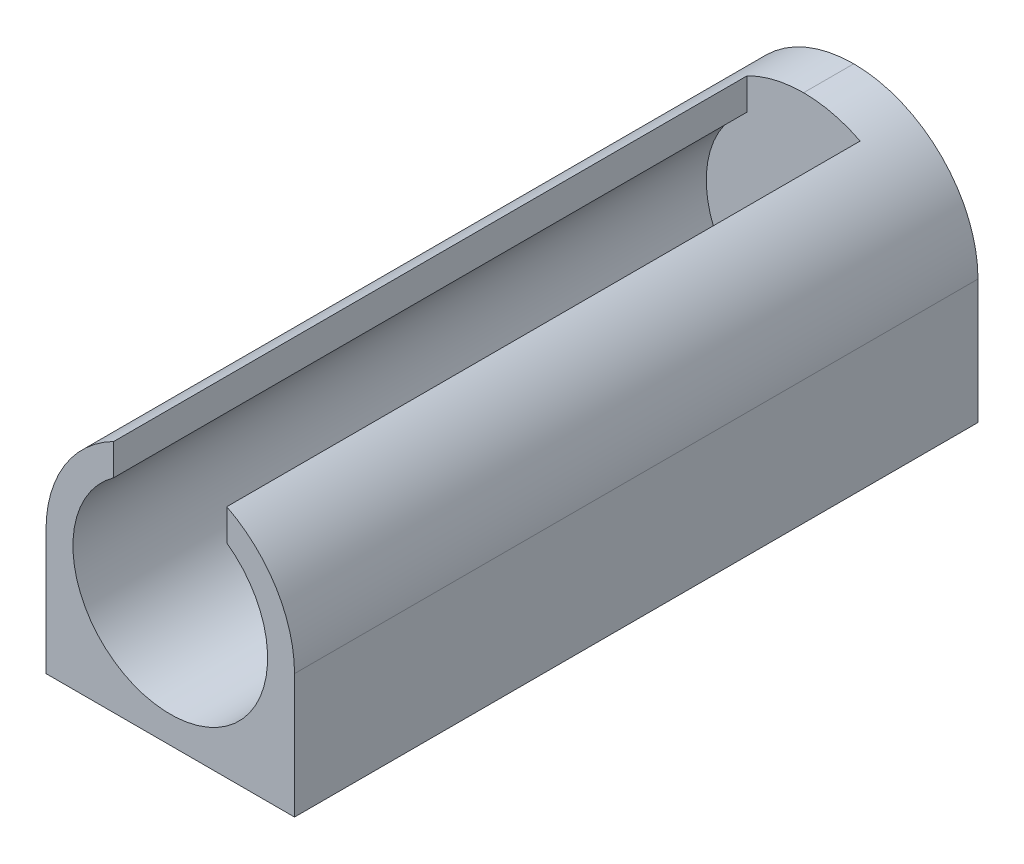
ISO-10303-21;
HEADER;
FILE_DESCRIPTION(('STEP AP214'),'2;1');
FILE_NAME('part.step','',(''),(''),'','','');
FILE_SCHEMA(('AUTOMOTIVE_DESIGN { 1 0 10303 214 1 1 1 1 }'));
ENDSEC;
DATA;
#1=APPLICATION_CONTEXT('core data for automotive mechanical design processes');
#2=APPLICATION_PROTOCOL_DEFINITION('international standard','automotive_design',2000,#1);
#3=PRODUCT_CONTEXT('',#1,'mechanical');
#4=PRODUCT('Part','Part','',(#3));
#5=PRODUCT_RELATED_PRODUCT_CATEGORY('part','',(#4));
#6=PRODUCT_DEFINITION_FORMATION('','',#4);
#7=PRODUCT_DEFINITION_CONTEXT('part definition',#1,'design');
#8=PRODUCT_DEFINITION('design','',#6,#7);
#9=PRODUCT_DEFINITION_SHAPE('','',#8);
#10=(LENGTH_UNIT() NAMED_UNIT(*) SI_UNIT(.MILLI.,.METRE.));
#11=(NAMED_UNIT(*) PLANE_ANGLE_UNIT() SI_UNIT($,.RADIAN.));
#12=(NAMED_UNIT(*) SI_UNIT($,.STERADIAN.) SOLID_ANGLE_UNIT());
#13=UNCERTAINTY_MEASURE_WITH_UNIT(LENGTH_MEASURE(1.E-05),#10,'distance_accuracy_value','');
#14=(GEOMETRIC_REPRESENTATION_CONTEXT(3) GLOBAL_UNCERTAINTY_ASSIGNED_CONTEXT((#13)) GLOBAL_UNIT_ASSIGNED_CONTEXT((#10,
#11,#12)) REPRESENTATION_CONTEXT('',''));
#15=CARTESIAN_POINT('',(0.,0.,0.));
#16=DIRECTION('',(0.,0.,1.));
#17=DIRECTION('',(1.,0.,0.));
#18=AXIS2_PLACEMENT_3D('',#15,#16,#17);
#19=CARTESIAN_POINT('',(0.,0.,41.91));
#20=DIRECTION('',(1.,0.,0.));
#21=DIRECTION('',(0.,0.,-1.));
#22=AXIS2_PLACEMENT_3D('',#19,#20,#21);
#23=PLANE('',#22);
#24=DIRECTION('',(0.,-1.,0.));
#25=VECTOR('',#24,1.);
#26=CARTESIAN_POINT('',(0.,0.,41.91));
#27=LINE('',#26,#25);
#28=CARTESIAN_POINT('',(0.,7.62,41.91));
#29=VERTEX_POINT('',#28);
#30=CARTESIAN_POINT('',(0.,0.,41.91));
#31=VERTEX_POINT('',#30);
#32=EDGE_CURVE('E136',#29,#31,#27,.T.);
#33=ORIENTED_EDGE('',*,*,#32,.F.);
#34=DIRECTION('',(0.,0.,-1.));
#35=VECTOR('',#34,1.);
#36=CARTESIAN_POINT('',(0.,7.62,41.91));
#37=LINE('',#36,#35);
#38=CARTESIAN_POINT('',(0.,7.62,0.));
#39=VERTEX_POINT('',#38);
#40=EDGE_CURVE('E165',#29,#39,#37,.T.);
#41=ORIENTED_EDGE('',*,*,#40,.T.);
#42=DIRECTION('',(0.,-1.,0.));
#43=VECTOR('',#42,1.);
#44=CARTESIAN_POINT('',(0.,0.,0.));
#45=LINE('',#44,#43);
#46=CARTESIAN_POINT('',(0.,0.,0.));
#47=VERTEX_POINT('',#46);
#48=EDGE_CURVE('E129',#39,#47,#45,.T.);
#49=ORIENTED_EDGE('',*,*,#48,.T.);
#50=DIRECTION('',(0.,0.,-1.));
#51=VECTOR('',#50,1.);
#52=CARTESIAN_POINT('',(0.,0.,41.91));
#53=LINE('',#52,#51);
#54=EDGE_CURVE('E152',#31,#47,#53,.T.);
#55=ORIENTED_EDGE('',*,*,#54,.F.);
#56=EDGE_LOOP('',(#33,#41,#49,#55));
#57=FACE_BOUND('',#56,.T.);
#58=ADVANCED_FACE('F35',(#57),#23,.F.);
#59=CARTESIAN_POINT('',(0.,0.,41.91));
#60=DIRECTION('',(0.,1.,0.));
#61=DIRECTION('',(0.,0.,1.));
#62=AXIS2_PLACEMENT_3D('',#59,#60,#61);
#63=PLANE('',#62);
#64=DIRECTION('',(1.,0.,0.));
#65=VECTOR('',#64,1.);
#66=CARTESIAN_POINT('',(0.,0.,0.));
#67=LINE('',#66,#65);
#68=CARTESIAN_POINT('',(15.24,0.,0.));
#69=VERTEX_POINT('',#68);
#70=EDGE_CURVE('E146',#47,#69,#67,.T.);
#71=ORIENTED_EDGE('',*,*,#70,.T.);
#72=DIRECTION('',(0.,0.,-1.));
#73=VECTOR('',#72,1.);
#74=CARTESIAN_POINT('',(15.24,0.,41.91));
#75=LINE('',#74,#73);
#76=CARTESIAN_POINT('',(15.24,0.,41.91));
#77=VERTEX_POINT('',#76);
#78=EDGE_CURVE('E144',#77,#69,#75,.T.);
#79=ORIENTED_EDGE('',*,*,#78,.F.);
#80=DIRECTION('',(1.,0.,0.));
#81=VECTOR('',#80,1.);
#82=CARTESIAN_POINT('',(0.,0.,41.91));
#83=LINE('',#82,#81);
#84=EDGE_CURVE('E138',#31,#77,#83,.T.);
#85=ORIENTED_EDGE('',*,*,#84,.F.);
#86=ORIENTED_EDGE('',*,*,#54,.T.);
#87=EDGE_LOOP('',(#71,#79,#85,#86));
#88=FACE_BOUND('',#87,.T.);
#89=ADVANCED_FACE('F210',(#88),#63,.F.);
#90=CARTESIAN_POINT('',(15.24,0.,41.91));
#91=DIRECTION('',(-1.,0.,0.));
#92=DIRECTION('',(0.,0.,1.));
#93=AXIS2_PLACEMENT_3D('',#90,#91,#92);
#94=PLANE('',#93);
#95=DIRECTION('',(0.,1.,0.));
#96=VECTOR('',#95,1.);
#97=CARTESIAN_POINT('',(15.24,0.,0.));
#98=LINE('',#97,#96);
#99=CARTESIAN_POINT('',(15.24,7.62,0.));
#100=VERTEX_POINT('',#99);
#101=EDGE_CURVE('E139',#69,#100,#98,.T.);
#102=ORIENTED_EDGE('',*,*,#101,.T.);
#103=DIRECTION('',(0.,0.,-1.));
#104=VECTOR('',#103,1.);
#105=CARTESIAN_POINT('',(15.24,7.62,41.91));
#106=LINE('',#105,#104);
#107=CARTESIAN_POINT('',(15.24,7.62,41.91));
#108=VERTEX_POINT('',#107);
#109=EDGE_CURVE('E159',#100,#108,#106,.F.);
#110=ORIENTED_EDGE('',*,*,#109,.T.);
#111=DIRECTION('',(0.,1.,0.));
#112=VECTOR('',#111,1.);
#113=CARTESIAN_POINT('',(15.24,0.,41.91));
#114=LINE('',#113,#112);
#115=EDGE_CURVE('E141',#77,#108,#114,.T.);
#116=ORIENTED_EDGE('',*,*,#115,.F.);
#117=ORIENTED_EDGE('',*,*,#78,.T.);
#118=EDGE_LOOP('',(#102,#110,#116,#117));
#119=FACE_BOUND('',#118,.T.);
#120=ADVANCED_FACE('F216',(#119),#94,.F.);
#121=CARTESIAN_POINT('',(0.,0.,41.91));
#122=DIRECTION('',(0.,0.,-1.));
#123=DIRECTION('',(-1.,0.,0.));
#124=AXIS2_PLACEMENT_3D('',#121,#122,#123);
#125=PLANE('',#124);
#126=CARTESIAN_POINT('',(7.62,7.62,41.91));
#127=DIRECTION('',(0.,0.,1.));
#128=DIRECTION('',(1.,0.,0.));
#129=AXIS2_PLACEMENT_3D('',#126,#127,#128);
#130=CIRCLE('',#129,5.969);
#131=CARTESIAN_POINT('',(4.15421620917245,12.4797637509695,41.91));
#132=VERTEX_POINT('',#131);
#133=CARTESIAN_POINT('',(11.0857837908275,12.4797637509695,41.91));
#134=VERTEX_POINT('',#133);
#135=EDGE_CURVE('E120',#132,#134,#130,.T.);
#136=ORIENTED_EDGE('',*,*,#135,.F.);
#137=DIRECTION('',(0.,-1.,0.));
#138=VECTOR('',#137,1.);
#139=CARTESIAN_POINT('',(4.15421620917245,12.4797637509695,41.91));
#140=LINE('',#139,#138);
#141=CARTESIAN_POINT('',(4.15421620917245,14.4062171137709,41.91));
#142=VERTEX_POINT('',#141);
#143=EDGE_CURVE('E105',#142,#132,#140,.T.);
#144=ORIENTED_EDGE('',*,*,#143,.F.);
#145=CARTESIAN_POINT('',(7.62,7.62,41.91));
#146=DIRECTION('',(0.,0.,-1.));
#147=DIRECTION('',(-1.,0.,0.));
#148=AXIS2_PLACEMENT_3D('',#145,#146,#147);
#149=CIRCLE('',#148,7.62);
#150=EDGE_CURVE('E58',#142,#29,#149,.F.);
#151=ORIENTED_EDGE('',*,*,#150,.T.);
#152=ORIENTED_EDGE('',*,*,#32,.T.);
#153=ORIENTED_EDGE('',*,*,#84,.T.);
#154=ORIENTED_EDGE('',*,*,#115,.T.);
#155=CARTESIAN_POINT('',(7.62,7.62,41.91));
#156=DIRECTION('',(0.,0.,-1.));
#157=DIRECTION('',(-1.,0.,0.));
#158=AXIS2_PLACEMENT_3D('',#155,#156,#157);
#159=CIRCLE('',#158,7.62);
#160=CARTESIAN_POINT('',(11.0857837908275,14.4062171137709,41.91));
#161=VERTEX_POINT('',#160);
#162=EDGE_CURVE('E163',#108,#161,#159,.F.);
#163=ORIENTED_EDGE('',*,*,#162,.T.);
#164=DIRECTION('',(0.,1.,0.));
#165=VECTOR('',#164,1.);
#166=CARTESIAN_POINT('',(11.0857837908275,12.4797637509695,41.91));
#167=LINE('',#166,#165);
#168=EDGE_CURVE('E113',#134,#161,#167,.T.);
#169=ORIENTED_EDGE('',*,*,#168,.F.);
#170=EDGE_LOOP('',(#136,#144,#151,#152,#153,#154,#163,#169));
#171=FACE_BOUND('',#170,.T.);
#172=ADVANCED_FACE('F125',(#171),#125,.F.);
#173=CARTESIAN_POINT('',(0.,0.,0.));
#174=DIRECTION('',(0.,0.,-1.));
#175=DIRECTION('',(-1.,0.,0.));
#176=AXIS2_PLACEMENT_3D('',#173,#174,#175);
#177=PLANE('',#176);
#178=CARTESIAN_POINT('',(7.62,7.61999999999998,0.));
#179=DIRECTION('',(0.,0.,1.));
#180=DIRECTION('',(1.,0.,0.));
#181=AXIS2_PLACEMENT_3D('',#178,#179,#180);
#182=CIRCLE('',#181,1.4605);
#183=CARTESIAN_POINT('',(9.0805,7.61999999999998,0.));
#184=VERTEX_POINT('',#183);
#185=EDGE_CURVE('E114',#184,#184,#182,.T.);
#186=ORIENTED_EDGE('',*,*,#185,.T.);
#187=EDGE_LOOP('',(#186));
#188=FACE_BOUND('',#187,.T.);
#189=CARTESIAN_POINT('',(7.62,7.62,0.));
#190=DIRECTION('',(0.,0.,-1.));
#191=DIRECTION('',(-1.,0.,0.));
#192=AXIS2_PLACEMENT_3D('',#189,#190,#191);
#193=CIRCLE('',#192,7.62);
#194=CARTESIAN_POINT('',(7.62,15.24,0.));
#195=VERTEX_POINT('',#194);
#196=EDGE_CURVE('E155',#39,#195,#193,.T.);
#197=ORIENTED_EDGE('',*,*,#196,.T.);
#198=CARTESIAN_POINT('',(7.62,7.62,0.));
#199=DIRECTION('',(0.,0.,-1.));
#200=DIRECTION('',(-1.,0.,0.));
#201=AXIS2_PLACEMENT_3D('',#198,#199,#200);
#202=CIRCLE('',#201,7.62);
#203=EDGE_CURVE('E157',#195,#100,#202,.T.);
#204=ORIENTED_EDGE('',*,*,#203,.T.);
#205=ORIENTED_EDGE('',*,*,#101,.F.);
#206=ORIENTED_EDGE('',*,*,#70,.F.);
#207=ORIENTED_EDGE('',*,*,#48,.F.);
#208=EDGE_LOOP('',(#197,#204,#205,#206,#207));
#209=FACE_BOUND('',#208,.T.);
#210=ADVANCED_FACE('F192',(#188,#209),#177,.T.);
#211=CARTESIAN_POINT('',(7.62,7.62,3.0734));
#212=DIRECTION('',(0.,0.,1.));
#213=DIRECTION('',(1.,0.,0.));
#214=AXIS2_PLACEMENT_3D('',#211,#212,#213);
#215=CYLINDRICAL_SURFACE('',#214,5.969);
#216=CARTESIAN_POINT('',(7.62,7.62,3.0734));
#217=DIRECTION('',(0.,0.,1.));
#218=DIRECTION('',(1.,0.,0.));
#219=AXIS2_PLACEMENT_3D('',#216,#217,#218);
#220=CIRCLE('',#219,5.969);
#221=CARTESIAN_POINT('',(4.15421620917245,12.4797637509695,3.0734));
#222=VERTEX_POINT('',#221);
#223=CARTESIAN_POINT('',(11.0857837908275,12.4797637509695,3.0734));
#224=VERTEX_POINT('',#223);
#225=EDGE_CURVE('E121',#222,#224,#220,.T.);
#226=ORIENTED_EDGE('',*,*,#225,.F.);
#227=DIRECTION('',(0.,0.,1.));
#228=VECTOR('',#227,1.);
#229=CARTESIAN_POINT('',(4.15421620917245,12.4797637509695,-4.528255374071));
#230=LINE('',#229,#228);
#231=EDGE_CURVE('E109',#222,#132,#230,.T.);
#232=ORIENTED_EDGE('',*,*,#231,.T.);
#233=ORIENTED_EDGE('',*,*,#135,.T.);
#234=DIRECTION('',(0.,0.,1.));
#235=VECTOR('',#234,1.);
#236=CARTESIAN_POINT('',(11.0857837908275,12.4797637509695,-4.528255374071));
#237=LINE('',#236,#235);
#238=EDGE_CURVE('E122',#224,#134,#237,.T.);
#239=ORIENTED_EDGE('',*,*,#238,.F.);
#240=EDGE_LOOP('',(#226,#232,#233,#239));
#241=FACE_BOUND('',#240,.T.);
#242=ADVANCED_FACE('F118',(#241),#215,.F.);
#243=CARTESIAN_POINT('',(7.62,7.62,3.0734));
#244=DIRECTION('',(0.,0.,1.));
#245=DIRECTION('',(1.,0.,0.));
#246=AXIS2_PLACEMENT_3D('',#243,#244,#245);
#247=PLANE('',#246);
#248=CARTESIAN_POINT('',(7.62,7.61999999999998,3.0734));
#249=DIRECTION('',(0.,0.,1.));
#250=DIRECTION('',(1.,0.,0.));
#251=AXIS2_PLACEMENT_3D('',#248,#249,#250);
#252=CIRCLE('',#251,1.4605);
#253=CARTESIAN_POINT('',(9.0805,7.61999999999998,3.0734));
#254=VERTEX_POINT('',#253);
#255=EDGE_CURVE('E186',#254,#254,#252,.T.);
#256=ORIENTED_EDGE('',*,*,#255,.F.);
#257=EDGE_LOOP('',(#256));
#258=FACE_BOUND('',#257,.T.);
#259=ORIENTED_EDGE('',*,*,#225,.T.);
#260=DIRECTION('',(0.,-1.,0.));
#261=VECTOR('',#260,1.);
#262=CARTESIAN_POINT('',(11.0857837908275,12.4797637509695,3.0734));
#263=LINE('',#262,#261);
#264=CARTESIAN_POINT('',(11.0857837908275,14.4062171137709,3.0734));
#265=VERTEX_POINT('',#264);
#266=EDGE_CURVE('E50',#265,#224,#263,.T.);
#267=ORIENTED_EDGE('',*,*,#266,.F.);
#268=CARTESIAN_POINT('',(7.62,7.62,3.0734));
#269=DIRECTION('',(0.,0.,1.));
#270=DIRECTION('',(1.,0.,0.));
#271=AXIS2_PLACEMENT_3D('',#268,#269,#270);
#272=CIRCLE('',#271,7.62);
#273=CARTESIAN_POINT('',(7.62,15.24,3.0734));
#274=VERTEX_POINT('',#273);
#275=EDGE_CURVE('E166',#274,#265,#272,.F.);
#276=ORIENTED_EDGE('',*,*,#275,.F.);
#277=CARTESIAN_POINT('',(7.62,7.62,3.0734));
#278=DIRECTION('',(0.,0.,1.));
#279=DIRECTION('',(1.,0.,0.));
#280=AXIS2_PLACEMENT_3D('',#277,#278,#279);
#281=CIRCLE('',#280,7.62);
#282=CARTESIAN_POINT('',(4.15421620917245,14.4062171137709,3.0734));
#283=VERTEX_POINT('',#282);
#284=EDGE_CURVE('E132',#283,#274,#281,.F.);
#285=ORIENTED_EDGE('',*,*,#284,.F.);
#286=DIRECTION('',(0.,1.,0.));
#287=VECTOR('',#286,1.);
#288=CARTESIAN_POINT('',(4.15421620917245,12.4797637509695,3.0734));
#289=LINE('',#288,#287);
#290=EDGE_CURVE('E180',#222,#283,#289,.T.);
#291=ORIENTED_EDGE('',*,*,#290,.F.);
#292=EDGE_LOOP('',(#259,#267,#276,#285,#291));
#293=FACE_BOUND('',#292,.T.);
#294=ADVANCED_FACE('F177',(#258,#293),#247,.T.);
#295=CARTESIAN_POINT('',(7.62,7.62,41.91));
#296=DIRECTION('',(0.,0.,-1.));
#297=DIRECTION('',(-1.,0.,0.));
#298=AXIS2_PLACEMENT_3D('',#295,#296,#297);
#299=CYLINDRICAL_SURFACE('',#298,7.62);
#300=DIRECTION('',(0.,0.,-1.));
#301=VECTOR('',#300,1.);
#302=CARTESIAN_POINT('',(4.15421620917245,14.4062171137709,41.91));
#303=LINE('',#302,#301);
#304=EDGE_CURVE('E11',#283,#142,#303,.F.);
#305=ORIENTED_EDGE('',*,*,#304,.F.);
#306=ORIENTED_EDGE('',*,*,#284,.T.);
#307=DIRECTION('',(0.,0.,-1.));
#308=VECTOR('',#307,1.);
#309=CARTESIAN_POINT('',(7.62,15.24,41.91));
#310=LINE('',#309,#308);
#311=EDGE_CURVE('E127',#195,#274,#310,.F.);
#312=ORIENTED_EDGE('',*,*,#311,.F.);
#313=ORIENTED_EDGE('',*,*,#196,.F.);
#314=ORIENTED_EDGE('',*,*,#40,.F.);
#315=ORIENTED_EDGE('',*,*,#150,.F.);
#316=EDGE_LOOP('',(#305,#306,#312,#313,#314,#315));
#317=FACE_BOUND('',#316,.T.);
#318=ADVANCED_FACE('F37',(#317),#299,.T.);
#319=CARTESIAN_POINT('',(7.62,7.62,41.91));
#320=DIRECTION('',(0.,0.,-1.));
#321=DIRECTION('',(-1.,0.,0.));
#322=AXIS2_PLACEMENT_3D('',#319,#320,#321);
#323=CYLINDRICAL_SURFACE('',#322,7.62);
#324=DIRECTION('',(0.,0.,-1.));
#325=VECTOR('',#324,1.);
#326=CARTESIAN_POINT('',(11.0857837908275,14.4062171137709,41.91));
#327=LINE('',#326,#325);
#328=EDGE_CURVE('E43',#161,#265,#327,.T.);
#329=ORIENTED_EDGE('',*,*,#328,.F.);
#330=ORIENTED_EDGE('',*,*,#162,.F.);
#331=ORIENTED_EDGE('',*,*,#109,.F.);
#332=ORIENTED_EDGE('',*,*,#203,.F.);
#333=ORIENTED_EDGE('',*,*,#311,.T.);
#334=ORIENTED_EDGE('',*,*,#275,.T.);
#335=EDGE_LOOP('',(#329,#330,#331,#332,#333,#334));
#336=FACE_BOUND('',#335,.T.);
#337=ADVANCED_FACE('F173',(#336),#323,.T.);
#338=CARTESIAN_POINT('',(4.15421620917245,12.4797637509695,-4.528255374071));
#339=DIRECTION('',(-1.,0.,0.));
#340=DIRECTION('',(0.,0.,1.));
#341=AXIS2_PLACEMENT_3D('',#338,#339,#340);
#342=PLANE('',#341);
#343=ORIENTED_EDGE('',*,*,#304,.T.);
#344=ORIENTED_EDGE('',*,*,#143,.T.);
#345=ORIENTED_EDGE('',*,*,#231,.F.);
#346=ORIENTED_EDGE('',*,*,#290,.T.);
#347=EDGE_LOOP('',(#343,#344,#345,#346));
#348=FACE_BOUND('',#347,.T.);
#349=ADVANCED_FACE('F107',(#348),#342,.F.);
#350=CARTESIAN_POINT('',(11.0857837908275,12.4797637509695,-4.528255374071));
#351=DIRECTION('',(1.,0.,0.));
#352=DIRECTION('',(0.,0.,-1.));
#353=AXIS2_PLACEMENT_3D('',#350,#351,#352);
#354=PLANE('',#353);
#355=ORIENTED_EDGE('',*,*,#328,.T.);
#356=ORIENTED_EDGE('',*,*,#266,.T.);
#357=ORIENTED_EDGE('',*,*,#238,.T.);
#358=ORIENTED_EDGE('',*,*,#168,.T.);
#359=EDGE_LOOP('',(#355,#356,#357,#358));
#360=FACE_BOUND('',#359,.T.);
#361=ADVANCED_FACE('F171',(#360),#354,.F.);
#362=CARTESIAN_POINT('',(7.62,7.61999999999998,0.));
#363=DIRECTION('',(0.,0.,1.));
#364=DIRECTION('',(1.,0.,0.));
#365=AXIS2_PLACEMENT_3D('',#362,#363,#364);
#366=CYLINDRICAL_SURFACE('',#365,1.4605);
#367=ORIENTED_EDGE('',*,*,#185,.F.);
#368=EDGE_LOOP('',(#367));
#369=FACE_BOUND('',#368,.T.);
#370=ORIENTED_EDGE('',*,*,#255,.T.);
#371=EDGE_LOOP('',(#370));
#372=FACE_BOUND('',#371,.T.);
#373=ADVANCED_FACE('F195',(#369,#372),#366,.F.);
#374=CLOSED_SHELL('',(#58,#89,#120,#172,#210,#242,#294,#318,#337,#349,#361,#373));
#375=MANIFOLD_SOLID_BREP('B2',#374);
#376=ADVANCED_BREP_SHAPE_REPRESENTATION('',(#18,#375),#14);
#377=SHAPE_DEFINITION_REPRESENTATION(#9,#376);
ENDSEC;
END-ISO-10303-21;
